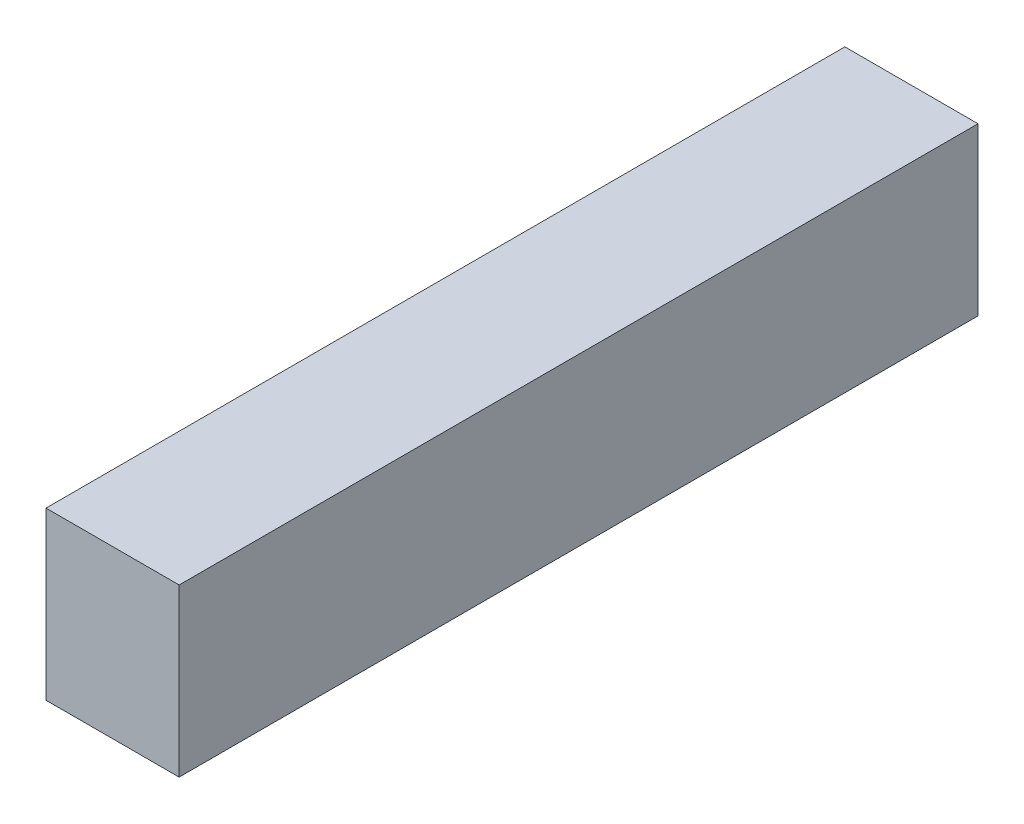
ISO-10303-21;
HEADER;
FILE_DESCRIPTION(('STEP AP214'),'2;1');
FILE_NAME('part.step','',(''),(''),'','','');
FILE_SCHEMA(('AUTOMOTIVE_DESIGN { 1 0 10303 214 1 1 1 1 }'));
ENDSEC;
DATA;
#1=APPLICATION_CONTEXT('core data for automotive mechanical design processes');
#2=APPLICATION_PROTOCOL_DEFINITION('international standard','automotive_design',2000,#1);
#3=PRODUCT_CONTEXT('',#1,'mechanical');
#4=PRODUCT('Part','Part','',(#3));
#5=PRODUCT_RELATED_PRODUCT_CATEGORY('part','',(#4));
#6=PRODUCT_DEFINITION_FORMATION('','',#4);
#7=PRODUCT_DEFINITION_CONTEXT('part definition',#1,'design');
#8=PRODUCT_DEFINITION('design','',#6,#7);
#9=PRODUCT_DEFINITION_SHAPE('','',#8);
#10=(LENGTH_UNIT() NAMED_UNIT(*) SI_UNIT(.MILLI.,.METRE.));
#11=(NAMED_UNIT(*) PLANE_ANGLE_UNIT() SI_UNIT($,.RADIAN.));
#12=(NAMED_UNIT(*) SI_UNIT($,.STERADIAN.) SOLID_ANGLE_UNIT());
#13=UNCERTAINTY_MEASURE_WITH_UNIT(LENGTH_MEASURE(1.E-05),#10,'distance_accuracy_value','');
#14=(GEOMETRIC_REPRESENTATION_CONTEXT(3) GLOBAL_UNCERTAINTY_ASSIGNED_CONTEXT((#13)) GLOBAL_UNIT_ASSIGNED_CONTEXT((#10,
#11,#12)) REPRESENTATION_CONTEXT('',''));
#15=CARTESIAN_POINT('',(0.,0.,0.));
#16=DIRECTION('',(0.,0.,1.));
#17=DIRECTION('',(1.,0.,0.));
#18=AXIS2_PLACEMENT_3D('',#15,#16,#17);
#19=CARTESIAN_POINT('',(4.,-10.,24.));
#20=DIRECTION('',(1.,0.,0.));
#21=DIRECTION('',(0.,0.,-1.));
#22=AXIS2_PLACEMENT_3D('',#19,#20,#21);
#23=PLANE('',#22);
#24=DIRECTION('',(0.,0.,-1.));
#25=VECTOR('',#24,1.);
#26=CARTESIAN_POINT('',(4.,0.,24.));
#27=LINE('',#26,#25);
#28=CARTESIAN_POINT('',(4.,0.,24.));
#29=VERTEX_POINT('',#28);
#30=CARTESIAN_POINT('',(4.,0.,-24.));
#31=VERTEX_POINT('',#30);
#32=EDGE_CURVE('E95',#29,#31,#27,.T.);
#33=ORIENTED_EDGE('',*,*,#32,.F.);
#34=DIRECTION('',(0.,1.,0.));
#35=VECTOR('',#34,1.);
#36=CARTESIAN_POINT('',(4.,-10.,24.));
#37=LINE('',#36,#35);
#38=CARTESIAN_POINT('',(4.,-10.,24.));
#39=VERTEX_POINT('',#38);
#40=EDGE_CURVE('E11',#39,#29,#37,.T.);
#41=ORIENTED_EDGE('',*,*,#40,.F.);
#42=DIRECTION('',(0.,0.,-1.));
#43=VECTOR('',#42,1.);
#44=CARTESIAN_POINT('',(4.,-10.,24.));
#45=LINE('',#44,#43);
#46=CARTESIAN_POINT('',(4.,-10.,-24.));
#47=VERTEX_POINT('',#46);
#48=EDGE_CURVE('E89',#39,#47,#45,.T.);
#49=ORIENTED_EDGE('',*,*,#48,.T.);
#50=DIRECTION('',(0.,1.,0.));
#51=VECTOR('',#50,1.);
#52=CARTESIAN_POINT('',(4.,-10.,-24.));
#53=LINE('',#52,#51);
#54=EDGE_CURVE('E34',#47,#31,#53,.T.);
#55=ORIENTED_EDGE('',*,*,#54,.T.);
#56=EDGE_LOOP('',(#33,#41,#49,#55));
#57=FACE_BOUND('',#56,.T.);
#58=ADVANCED_FACE('F31',(#57),#23,.T.);
#59=CARTESIAN_POINT('',(-4.,-10.,24.));
#60=DIRECTION('',(0.,0.,1.));
#61=DIRECTION('',(1.,0.,0.));
#62=AXIS2_PLACEMENT_3D('',#59,#60,#61);
#63=PLANE('',#62);
#64=DIRECTION('',(1.,0.,0.));
#65=VECTOR('',#64,1.);
#66=CARTESIAN_POINT('',(-4.,0.,24.));
#67=LINE('',#66,#65);
#68=CARTESIAN_POINT('',(-4.,0.,24.));
#69=VERTEX_POINT('',#68);
#70=EDGE_CURVE('E91',#69,#29,#67,.T.);
#71=ORIENTED_EDGE('',*,*,#70,.F.);
#72=DIRECTION('',(0.,1.,0.));
#73=VECTOR('',#72,1.);
#74=CARTESIAN_POINT('',(-4.,-10.,24.));
#75=LINE('',#74,#73);
#76=CARTESIAN_POINT('',(-4.,-10.,24.));
#77=VERTEX_POINT('',#76);
#78=EDGE_CURVE('E40',#77,#69,#75,.T.);
#79=ORIENTED_EDGE('',*,*,#78,.F.);
#80=DIRECTION('',(1.,0.,0.));
#81=VECTOR('',#80,1.);
#82=CARTESIAN_POINT('',(-4.,-10.,24.));
#83=LINE('',#82,#81);
#84=EDGE_CURVE('E86',#77,#39,#83,.T.);
#85=ORIENTED_EDGE('',*,*,#84,.T.);
#86=ORIENTED_EDGE('',*,*,#40,.T.);
#87=EDGE_LOOP('',(#71,#79,#85,#86));
#88=FACE_BOUND('',#87,.T.);
#89=ADVANCED_FACE('F105',(#88),#63,.T.);
#90=CARTESIAN_POINT('',(-4.,-10.,24.));
#91=DIRECTION('',(-1.,0.,0.));
#92=DIRECTION('',(0.,0.,1.));
#93=AXIS2_PLACEMENT_3D('',#90,#91,#92);
#94=PLANE('',#93);
#95=DIRECTION('',(0.,0.,1.));
#96=VECTOR('',#95,1.);
#97=CARTESIAN_POINT('',(-4.,0.,24.));
#98=LINE('',#97,#96);
#99=CARTESIAN_POINT('',(-4.,0.,-24.));
#100=VERTEX_POINT('',#99);
#101=EDGE_CURVE('E81',#100,#69,#98,.T.);
#102=ORIENTED_EDGE('',*,*,#101,.F.);
#103=DIRECTION('',(0.,1.,0.));
#104=VECTOR('',#103,1.);
#105=CARTESIAN_POINT('',(-4.,-10.,-24.));
#106=LINE('',#105,#104);
#107=CARTESIAN_POINT('',(-4.,-10.,-24.));
#108=VERTEX_POINT('',#107);
#109=EDGE_CURVE('E76',#108,#100,#106,.T.);
#110=ORIENTED_EDGE('',*,*,#109,.F.);
#111=DIRECTION('',(0.,0.,1.));
#112=VECTOR('',#111,1.);
#113=CARTESIAN_POINT('',(-4.,-10.,24.));
#114=LINE('',#113,#112);
#115=EDGE_CURVE('E79',#108,#77,#114,.T.);
#116=ORIENTED_EDGE('',*,*,#115,.T.);
#117=ORIENTED_EDGE('',*,*,#78,.T.);
#118=EDGE_LOOP('',(#102,#110,#116,#117));
#119=FACE_BOUND('',#118,.T.);
#120=ADVANCED_FACE('F78',(#119),#94,.T.);
#121=CARTESIAN_POINT('',(-4.,-10.,-24.));
#122=DIRECTION('',(0.,0.,-1.));
#123=DIRECTION('',(-1.,0.,0.));
#124=AXIS2_PLACEMENT_3D('',#121,#122,#123);
#125=PLANE('',#124);
#126=DIRECTION('',(-1.,0.,0.));
#127=VECTOR('',#126,1.);
#128=CARTESIAN_POINT('',(-4.,0.,-24.));
#129=LINE('',#128,#127);
#130=EDGE_CURVE('E98',#31,#100,#129,.T.);
#131=ORIENTED_EDGE('',*,*,#130,.F.);
#132=ORIENTED_EDGE('',*,*,#54,.F.);
#133=DIRECTION('',(-1.,0.,0.));
#134=VECTOR('',#133,1.);
#135=CARTESIAN_POINT('',(-4.,-10.,-24.));
#136=LINE('',#135,#134);
#137=EDGE_CURVE('E85',#47,#108,#136,.T.);
#138=ORIENTED_EDGE('',*,*,#137,.T.);
#139=ORIENTED_EDGE('',*,*,#109,.T.);
#140=EDGE_LOOP('',(#131,#132,#138,#139));
#141=FACE_BOUND('',#140,.T.);
#142=ADVANCED_FACE('F88',(#141),#125,.T.);
#143=CARTESIAN_POINT('',(4.,-10.,-24.));
#144=DIRECTION('',(0.,-1.,0.));
#145=DIRECTION('',(0.,0.,-1.));
#146=AXIS2_PLACEMENT_3D('',#143,#144,#145);
#147=PLANE('',#146);
#148=ORIENTED_EDGE('',*,*,#48,.F.);
#149=ORIENTED_EDGE('',*,*,#84,.F.);
#150=ORIENTED_EDGE('',*,*,#115,.F.);
#151=ORIENTED_EDGE('',*,*,#137,.F.);
#152=EDGE_LOOP('',(#148,#149,#150,#151));
#153=FACE_BOUND('',#152,.T.);
#154=ADVANCED_FACE('F84',(#153),#147,.T.);
#155=CARTESIAN_POINT('',(4.,0.,-24.));
#156=DIRECTION('',(0.,-1.,0.));
#157=DIRECTION('',(0.,0.,-1.));
#158=AXIS2_PLACEMENT_3D('',#155,#156,#157);
#159=PLANE('',#158);
#160=ORIENTED_EDGE('',*,*,#32,.T.);
#161=ORIENTED_EDGE('',*,*,#130,.T.);
#162=ORIENTED_EDGE('',*,*,#101,.T.);
#163=ORIENTED_EDGE('',*,*,#70,.T.);
#164=EDGE_LOOP('',(#160,#161,#162,#163));
#165=FACE_BOUND('',#164,.T.);
#166=ADVANCED_FACE('F104',(#165),#159,.F.);
#167=CLOSED_SHELL('',(#58,#89,#120,#142,#154,#166));
#168=MANIFOLD_SOLID_BREP('B2',#167);
#169=ADVANCED_BREP_SHAPE_REPRESENTATION('',(#18,#168),#14);
#170=SHAPE_DEFINITION_REPRESENTATION(#9,#169);
ENDSEC;
END-ISO-10303-21;
